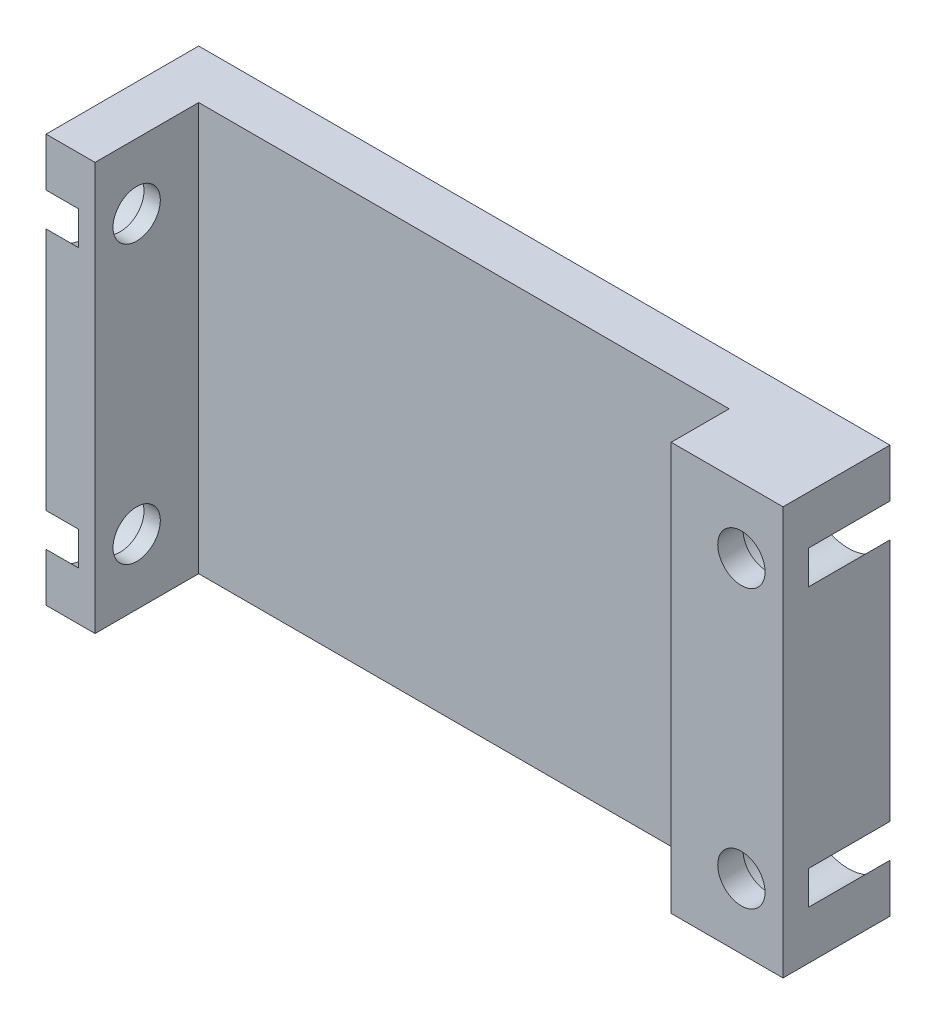
ISO-10303-21;
HEADER;
FILE_DESCRIPTION(('STEP AP214'),'2;1');
FILE_NAME('part.step','',(''),(''),'','','');
FILE_SCHEMA(('AUTOMOTIVE_DESIGN { 1 0 10303 214 1 1 1 1 }'));
ENDSEC;
DATA;
#1=APPLICATION_CONTEXT('core data for automotive mechanical design processes');
#2=APPLICATION_PROTOCOL_DEFINITION('international standard','automotive_design',2000,#1);
#3=PRODUCT_CONTEXT('',#1,'mechanical');
#4=PRODUCT('Part','Part','',(#3));
#5=PRODUCT_RELATED_PRODUCT_CATEGORY('part','',(#4));
#6=PRODUCT_DEFINITION_FORMATION('','',#4);
#7=PRODUCT_DEFINITION_CONTEXT('part definition',#1,'design');
#8=PRODUCT_DEFINITION('design','',#6,#7);
#9=PRODUCT_DEFINITION_SHAPE('','',#8);
#10=(LENGTH_UNIT() NAMED_UNIT(*) SI_UNIT(.MILLI.,.METRE.));
#11=(NAMED_UNIT(*) PLANE_ANGLE_UNIT() SI_UNIT($,.RADIAN.));
#12=(NAMED_UNIT(*) SI_UNIT($,.STERADIAN.) SOLID_ANGLE_UNIT());
#13=UNCERTAINTY_MEASURE_WITH_UNIT(LENGTH_MEASURE(1.E-05),#10,'distance_accuracy_value','');
#14=(GEOMETRIC_REPRESENTATION_CONTEXT(3) GLOBAL_UNCERTAINTY_ASSIGNED_CONTEXT((#13)) GLOBAL_UNIT_ASSIGNED_CONTEXT((#10,
#11,#12)) REPRESENTATION_CONTEXT('',''));
#15=CARTESIAN_POINT('',(0.,0.,0.));
#16=DIRECTION('',(0.,0.,1.));
#17=DIRECTION('',(1.,0.,0.));
#18=AXIS2_PLACEMENT_3D('',#15,#16,#17);
#19=CARTESIAN_POINT('',(-1.5,-22.5000000000001,-30.7214913134743));
#20=DIRECTION('',(-1.,0.,0.));
#21=DIRECTION('',(0.,0.,1.));
#22=AXIS2_PLACEMENT_3D('',#19,#20,#21);
#23=PLANE('',#22);
#24=DIRECTION('',(0.,1.,0.));
#25=VECTOR('',#24,1.);
#26=CARTESIAN_POINT('',(-1.5,-22.5000000000001,-3.79999999999977));
#27=LINE('',#26,#25);
#28=CARTESIAN_POINT('',(-1.5,-22.5000000000001,-3.79999999999977));
#29=VERTEX_POINT('',#28);
#30=CARTESIAN_POINT('',(-1.5,2.49999999999995,-3.79999999999978));
#31=VERTEX_POINT('',#30);
#32=EDGE_CURVE('E186',#29,#31,#27,.T.);
#33=ORIENTED_EDGE('',*,*,#32,.F.);
#34=DIRECTION('',(0.,0.,1.));
#35=VECTOR('',#34,1.);
#36=CARTESIAN_POINT('',(-1.5,-22.5000000000001,-30.7214913134743));
#37=LINE('',#36,#35);
#38=CARTESIAN_POINT('',(-1.5,-22.5000000000001,-0.25));
#39=VERTEX_POINT('',#38);
#40=EDGE_CURVE('E203',#29,#39,#37,.T.);
#41=ORIENTED_EDGE('',*,*,#40,.T.);
#42=DIRECTION('',(0.,-1.,0.));
#43=VECTOR('',#42,1.);
#44=CARTESIAN_POINT('',(-1.5,-22.5000000000001,-0.25));
#45=LINE('',#44,#43);
#46=CARTESIAN_POINT('',(-1.5,2.49999999999995,-0.25));
#47=VERTEX_POINT('',#46);
#48=EDGE_CURVE('E191',#47,#39,#45,.T.);
#49=ORIENTED_EDGE('',*,*,#48,.F.);
#50=DIRECTION('',(0.,0.,1.));
#51=VECTOR('',#50,1.);
#52=CARTESIAN_POINT('',(-1.5,2.49999999999995,-30.7214913134743));
#53=LINE('',#52,#51);
#54=EDGE_CURVE('E190',#31,#47,#53,.T.);
#55=ORIENTED_EDGE('',*,*,#54,.F.);
#56=EDGE_LOOP('',(#33,#41,#49,#55));
#57=FACE_BOUND('',#56,.T.);
#58=ADVANCED_FACE('F36',(#57),#23,.T.);
#59=CARTESIAN_POINT('',(-1.5,2.49999999999995,-30.7214913134743));
#60=DIRECTION('',(0.,1.,0.));
#61=DIRECTION('',(0.,0.,1.));
#62=AXIS2_PLACEMENT_3D('',#59,#60,#61);
#63=PLANE('',#62);
#64=DIRECTION('',(0.,0.,1.));
#65=VECTOR('',#64,1.);
#66=CARTESIAN_POINT('',(5.35008846034397,2.49999999999995,-30.7214913134743));
#67=LINE('',#66,#65);
#68=CARTESIAN_POINT('',(5.35008846034396,2.49999999999995,-6.79999999999978));
#69=VERTEX_POINT('',#68);
#70=CARTESIAN_POINT('',(5.35008846034397,2.49999999999995,-0.25));
#71=VERTEX_POINT('',#70);
#72=EDGE_CURVE('E205',#69,#71,#67,.T.);
#73=ORIENTED_EDGE('',*,*,#72,.F.);
#74=DIRECTION('',(1.,0.,0.));
#75=VECTOR('',#74,1.);
#76=CARTESIAN_POINT('',(5.35008846034396,2.49999999999995,-6.79999999999978));
#77=LINE('',#76,#75);
#78=CARTESIAN_POINT('',(-37.,2.49999999999995,-6.79999999999978));
#79=VERTEX_POINT('',#78);
#80=EDGE_CURVE('E166',#79,#69,#77,.T.);
#81=ORIENTED_EDGE('',*,*,#80,.F.);
#82=DIRECTION('',(0.,0.,-1.));
#83=VECTOR('',#82,1.);
#84=CARTESIAN_POINT('',(-37.,2.49999999999995,-6.79999999999978));
#85=LINE('',#84,#83);
#86=CARTESIAN_POINT('',(-37.,2.49999999999995,2.55));
#87=VERTEX_POINT('',#86);
#88=EDGE_CURVE('E278',#87,#79,#85,.T.);
#89=ORIENTED_EDGE('',*,*,#88,.F.);
#90=DIRECTION('',(1.,0.,0.));
#91=VECTOR('',#90,1.);
#92=CARTESIAN_POINT('',(-37.,2.49999999999995,2.55));
#93=LINE('',#92,#91);
#94=CARTESIAN_POINT('',(-34.,2.49999999999995,2.55));
#95=VERTEX_POINT('',#94);
#96=EDGE_CURVE('E282',#87,#95,#93,.T.);
#97=ORIENTED_EDGE('',*,*,#96,.T.);
#98=DIRECTION('',(0.,0.,-1.));
#99=VECTOR('',#98,1.);
#100=CARTESIAN_POINT('',(-34.,2.49999999999995,-6.79999999999978));
#101=LINE('',#100,#99);
#102=CARTESIAN_POINT('',(-34.,2.49999999999995,-3.79999999999978));
#103=VERTEX_POINT('',#102);
#104=EDGE_CURVE('E272',#95,#103,#101,.T.);
#105=ORIENTED_EDGE('',*,*,#104,.T.);
#106=DIRECTION('',(1.,0.,0.));
#107=VECTOR('',#106,1.);
#108=CARTESIAN_POINT('',(5.35008846034396,2.49999999999995,-3.79999999999978));
#109=LINE('',#108,#107);
#110=EDGE_CURVE('E173',#103,#31,#109,.T.);
#111=ORIENTED_EDGE('',*,*,#110,.T.);
#112=ORIENTED_EDGE('',*,*,#54,.T.);
#113=DIRECTION('',(-1.,0.,0.));
#114=VECTOR('',#113,1.);
#115=CARTESIAN_POINT('',(-1.5,2.49999999999995,-0.25));
#116=LINE('',#115,#114);
#117=EDGE_CURVE('E200',#71,#47,#116,.T.);
#118=ORIENTED_EDGE('',*,*,#117,.F.);
#119=EDGE_LOOP('',(#73,#81,#89,#97,#105,#111,#112,#118));
#120=FACE_BOUND('',#119,.T.);
#121=ADVANCED_FACE('F311',(#120),#63,.T.);
#122=CARTESIAN_POINT('',(5.35008846034397,-22.5000000000001,-30.7214913134743));
#123=DIRECTION('',(1.,0.,0.));
#124=DIRECTION('',(0.,0.,-1.));
#125=AXIS2_PLACEMENT_3D('',#122,#123,#124);
#126=PLANE('',#125);
#127=DIRECTION('',(0.,0.,-1.));
#128=VECTOR('',#127,1.);
#129=CARTESIAN_POINT('',(5.35008846034396,-2.52934389026236,-6.79999999999978));
#130=LINE('',#129,#128);
#131=CARTESIAN_POINT('',(5.35008846034397,-2.52934389026236,-1.79999999999977));
#132=VERTEX_POINT('',#131);
#133=CARTESIAN_POINT('',(5.35008846034396,-2.52934389026236,-6.79999999999978));
#134=VERTEX_POINT('',#133);
#135=EDGE_CURVE('E50',#132,#134,#130,.T.);
#136=ORIENTED_EDGE('',*,*,#135,.F.);
#137=DIRECTION('',(0.,-1.,0.));
#138=VECTOR('',#137,1.);
#139=CARTESIAN_POINT('',(5.35008846034397,-22.5000000000001,-1.79999999999977));
#140=LINE('',#139,#138);
#141=CARTESIAN_POINT('',(5.35008846034397,-0.470656109737746,-1.79999999999977));
#142=VERTEX_POINT('',#141);
#143=EDGE_CURVE('E11',#142,#132,#140,.T.);
#144=ORIENTED_EDGE('',*,*,#143,.F.);
#145=DIRECTION('',(0.,0.,-1.));
#146=VECTOR('',#145,1.);
#147=CARTESIAN_POINT('',(5.35008846034396,-0.470656109737747,-6.79999999999978));
#148=LINE('',#147,#146);
#149=CARTESIAN_POINT('',(5.35008846034396,-0.470656109737745,-6.79999999999978));
#150=VERTEX_POINT('',#149);
#151=EDGE_CURVE('E149',#150,#142,#148,.F.);
#152=ORIENTED_EDGE('',*,*,#151,.F.);
#153=DIRECTION('',(0.,-1.,0.));
#154=VECTOR('',#153,1.);
#155=CARTESIAN_POINT('',(5.35008846034396,2.49999999999995,-6.79999999999978));
#156=LINE('',#155,#154);
#157=EDGE_CURVE('E160',#69,#150,#156,.T.);
#158=ORIENTED_EDGE('',*,*,#157,.F.);
#159=ORIENTED_EDGE('',*,*,#72,.T.);
#160=DIRECTION('',(0.,1.,0.));
#161=VECTOR('',#160,1.);
#162=CARTESIAN_POINT('',(5.35008846034397,-22.5000000000001,-0.25));
#163=LINE('',#162,#161);
#164=CARTESIAN_POINT('',(5.35008846034397,-22.5000000000001,-0.25));
#165=VERTEX_POINT('',#164);
#166=EDGE_CURVE('E197',#165,#71,#163,.T.);
#167=ORIENTED_EDGE('',*,*,#166,.F.);
#168=DIRECTION('',(0.,0.,1.));
#169=VECTOR('',#168,1.);
#170=CARTESIAN_POINT('',(5.35008846034397,-22.5000000000001,-30.7214913134743));
#171=LINE('',#170,#169);
#172=CARTESIAN_POINT('',(5.35008846034396,-22.5000000000001,-6.79999999999978));
#173=VERTEX_POINT('',#172);
#174=EDGE_CURVE('E207',#173,#165,#171,.T.);
#175=ORIENTED_EDGE('',*,*,#174,.F.);
#176=CARTESIAN_POINT('',(5.35008846034396,-19.5293438902624,-6.79999999999978));
#177=VERTEX_POINT('',#176);
#178=EDGE_CURVE('E170',#177,#173,#156,.T.);
#179=ORIENTED_EDGE('',*,*,#178,.F.);
#180=DIRECTION('',(0.,0.,-1.));
#181=VECTOR('',#180,1.);
#182=CARTESIAN_POINT('',(5.35008846034396,-19.5293438902624,-6.79999999999978));
#183=LINE('',#182,#181);
#184=CARTESIAN_POINT('',(5.35008846034397,-19.5293438902624,-1.79999999999977));
#185=VERTEX_POINT('',#184);
#186=EDGE_CURVE('E58',#185,#177,#183,.T.);
#187=ORIENTED_EDGE('',*,*,#186,.F.);
#188=DIRECTION('',(0.,-1.,0.));
#189=VECTOR('',#188,1.);
#190=CARTESIAN_POINT('',(5.35008846034397,-22.5000000000001,-1.79999999999977));
#191=LINE('',#190,#189);
#192=CARTESIAN_POINT('',(5.35008846034397,-17.4706561097377,-1.79999999999977));
#193=VERTEX_POINT('',#192);
#194=EDGE_CURVE('E154',#193,#185,#191,.T.);
#195=ORIENTED_EDGE('',*,*,#194,.F.);
#196=DIRECTION('',(0.,0.,-1.));
#197=VECTOR('',#196,1.);
#198=CARTESIAN_POINT('',(5.35008846034396,-17.4706561097377,-6.79999999999978));
#199=LINE('',#198,#197);
#200=CARTESIAN_POINT('',(5.35008846034396,-17.4706561097377,-6.79999999999978));
#201=VERTEX_POINT('',#200);
#202=EDGE_CURVE('E236',#201,#193,#199,.F.);
#203=ORIENTED_EDGE('',*,*,#202,.F.);
#204=EDGE_CURVE('E168',#134,#201,#156,.T.);
#205=ORIENTED_EDGE('',*,*,#204,.F.);
#206=EDGE_LOOP('',(#136,#144,#152,#158,#159,#167,#175,#179,#187,#195,#203,#205));
#207=FACE_BOUND('',#206,.T.);
#208=ADVANCED_FACE('F159',(#207),#126,.T.);
#209=CARTESIAN_POINT('',(-1.5,-22.5000000000001,-30.7214913134743));
#210=DIRECTION('',(0.,-1.,0.));
#211=DIRECTION('',(0.,0.,-1.));
#212=AXIS2_PLACEMENT_3D('',#209,#210,#211);
#213=PLANE('',#212);
#214=ORIENTED_EDGE('',*,*,#40,.F.);
#215=DIRECTION('',(-1.,0.,0.));
#216=VECTOR('',#215,1.);
#217=CARTESIAN_POINT('',(5.35008846034396,-22.5000000000001,-3.79999999999978));
#218=LINE('',#217,#216);
#219=CARTESIAN_POINT('',(-34.,-22.5000000000001,-3.79999999999978));
#220=VERTEX_POINT('',#219);
#221=EDGE_CURVE('E182',#29,#220,#218,.T.);
#222=ORIENTED_EDGE('',*,*,#221,.T.);
#223=DIRECTION('',(0.,0.,1.));
#224=VECTOR('',#223,1.);
#225=CARTESIAN_POINT('',(-34.,-22.5000000000001,-6.79999999999978));
#226=LINE('',#225,#224);
#227=CARTESIAN_POINT('',(-34.,-22.5000000000001,2.55));
#228=VERTEX_POINT('',#227);
#229=EDGE_CURVE('E264',#220,#228,#226,.T.);
#230=ORIENTED_EDGE('',*,*,#229,.T.);
#231=DIRECTION('',(1.,0.,0.));
#232=VECTOR('',#231,1.);
#233=CARTESIAN_POINT('',(-37.,-22.5000000000001,2.55));
#234=LINE('',#233,#232);
#235=CARTESIAN_POINT('',(-37.,-22.5000000000001,2.55));
#236=VERTEX_POINT('',#235);
#237=EDGE_CURVE('E288',#236,#228,#234,.T.);
#238=ORIENTED_EDGE('',*,*,#237,.F.);
#239=DIRECTION('',(0.,0.,1.));
#240=VECTOR('',#239,1.);
#241=CARTESIAN_POINT('',(-37.,-22.5000000000001,-6.79999999999978));
#242=LINE('',#241,#240);
#243=CARTESIAN_POINT('',(-37.,-22.5000000000001,-6.79999999999978));
#244=VERTEX_POINT('',#243);
#245=EDGE_CURVE('E271',#244,#236,#242,.T.);
#246=ORIENTED_EDGE('',*,*,#245,.F.);
#247=DIRECTION('',(-1.,0.,0.));
#248=VECTOR('',#247,1.);
#249=CARTESIAN_POINT('',(5.35008846034396,-22.5000000000001,-6.79999999999978));
#250=LINE('',#249,#248);
#251=EDGE_CURVE('E167',#173,#244,#250,.T.);
#252=ORIENTED_EDGE('',*,*,#251,.F.);
#253=ORIENTED_EDGE('',*,*,#174,.T.);
#254=DIRECTION('',(1.,0.,0.));
#255=VECTOR('',#254,1.);
#256=CARTESIAN_POINT('',(-1.5,-22.5000000000001,-0.25));
#257=LINE('',#256,#255);
#258=EDGE_CURVE('E194',#39,#165,#257,.T.);
#259=ORIENTED_EDGE('',*,*,#258,.F.);
#260=EDGE_LOOP('',(#214,#222,#230,#238,#246,#252,#253,#259));
#261=FACE_BOUND('',#260,.T.);
#262=ADVANCED_FACE('F299',(#261),#213,.T.);
#263=CARTESIAN_POINT('',(0.,0.,-0.25));
#264=DIRECTION('',(0.,0.,-1.));
#265=DIRECTION('',(-1.,0.,0.));
#266=AXIS2_PLACEMENT_3D('',#263,#264,#265);
#267=PLANE('',#266);
#268=CARTESIAN_POINT('',(2.79999999999996,-1.50000000000005,-0.25));
#269=DIRECTION('',(0.,0.,-1.));
#270=DIRECTION('',(-1.,0.,0.));
#271=AXIS2_PLACEMENT_3D('',#268,#269,#270);
#272=CIRCLE('',#271,1.45);
#273=CARTESIAN_POINT('',(1.34999999999996,-1.50000000000005,-0.25));
#274=VERTEX_POINT('',#273);
#275=EDGE_CURVE('E161',#274,#274,#272,.T.);
#276=ORIENTED_EDGE('',*,*,#275,.T.);
#277=EDGE_LOOP('',(#276));
#278=FACE_BOUND('',#277,.T.);
#279=CARTESIAN_POINT('',(2.79999999999996,-18.5000000000001,-0.25));
#280=DIRECTION('',(0.,0.,-1.));
#281=DIRECTION('',(-1.,0.,0.));
#282=AXIS2_PLACEMENT_3D('',#279,#280,#281);
#283=CIRCLE('',#282,1.45);
#284=CARTESIAN_POINT('',(1.34999999999996,-18.5000000000001,-0.25));
#285=VERTEX_POINT('',#284);
#286=EDGE_CURVE('E233',#285,#285,#283,.T.);
#287=ORIENTED_EDGE('',*,*,#286,.T.);
#288=EDGE_LOOP('',(#287));
#289=FACE_BOUND('',#288,.T.);
#290=ORIENTED_EDGE('',*,*,#48,.T.);
#291=ORIENTED_EDGE('',*,*,#258,.T.);
#292=ORIENTED_EDGE('',*,*,#166,.T.);
#293=ORIENTED_EDGE('',*,*,#117,.T.);
#294=EDGE_LOOP('',(#290,#291,#292,#293));
#295=FACE_BOUND('',#294,.T.);
#296=ADVANCED_FACE('F353',(#278,#289,#295),#267,.F.);
#297=CARTESIAN_POINT('',(0.,0.,-3.79999999999978));
#298=DIRECTION('',(0.,0.,-1.));
#299=DIRECTION('',(-1.,0.,0.));
#300=AXIS2_PLACEMENT_3D('',#297,#298,#299);
#301=PLANE('',#300);
#302=ORIENTED_EDGE('',*,*,#221,.F.);
#303=ORIENTED_EDGE('',*,*,#32,.T.);
#304=ORIENTED_EDGE('',*,*,#110,.F.);
#305=DIRECTION('',(0.,1.,0.));
#306=VECTOR('',#305,1.);
#307=CARTESIAN_POINT('',(-34.,2.49999999999995,-3.79999999999978));
#308=LINE('',#307,#306);
#309=EDGE_CURVE('E177',#220,#103,#308,.T.);
#310=ORIENTED_EDGE('',*,*,#309,.F.);
#311=EDGE_LOOP('',(#302,#303,#304,#310));
#312=FACE_BOUND('',#311,.T.);
#313=ADVANCED_FACE('F303',(#312),#301,.F.);
#314=CARTESIAN_POINT('',(0.,0.,-6.79999999999978));
#315=DIRECTION('',(0.,0.,-1.));
#316=DIRECTION('',(-1.,0.,0.));
#317=AXIS2_PLACEMENT_3D('',#314,#315,#316);
#318=PLANE('',#317);
#319=CARTESIAN_POINT('',(2.79999999999996,-1.50000000000005,-6.79999999999978));
#320=DIRECTION('',(0.,0.,-1.));
#321=DIRECTION('',(-1.,0.,0.));
#322=AXIS2_PLACEMENT_3D('',#319,#320,#321);
#323=CIRCLE('',#322,2.75);
#324=EDGE_CURVE('E43',#134,#150,#323,.T.);
#325=ORIENTED_EDGE('',*,*,#324,.F.);
#326=ORIENTED_EDGE('',*,*,#204,.T.);
#327=CARTESIAN_POINT('',(2.79999999999996,-18.5000000000001,-6.79999999999978));
#328=DIRECTION('',(0.,0.,-1.));
#329=DIRECTION('',(-1.,0.,0.));
#330=AXIS2_PLACEMENT_3D('',#327,#328,#329);
#331=CIRCLE('',#330,2.75);
#332=EDGE_CURVE('E220',#177,#201,#331,.T.);
#333=ORIENTED_EDGE('',*,*,#332,.F.);
#334=ORIENTED_EDGE('',*,*,#178,.T.);
#335=ORIENTED_EDGE('',*,*,#251,.T.);
#336=DIRECTION('',(0.,-1.,0.));
#337=VECTOR('',#336,1.);
#338=CARTESIAN_POINT('',(-37.,-22.5000000000001,-6.79999999999978));
#339=LINE('',#338,#337);
#340=EDGE_CURVE('E268',#79,#244,#339,.T.);
#341=ORIENTED_EDGE('',*,*,#340,.F.);
#342=ORIENTED_EDGE('',*,*,#80,.T.);
#343=ORIENTED_EDGE('',*,*,#157,.T.);
#344=EDGE_LOOP('',(#325,#326,#333,#334,#335,#341,#342,#343));
#345=FACE_BOUND('',#344,.T.);
#346=ADVANCED_FACE('F164',(#345),#318,.T.);
#347=CARTESIAN_POINT('',(-37.,-22.5000000000001,2.55));
#348=DIRECTION('',(0.,0.,-1.));
#349=DIRECTION('',(-1.,0.,0.));
#350=AXIS2_PLACEMENT_3D('',#347,#348,#349);
#351=PLANE('',#350);
#352=DIRECTION('',(0.,-1.,0.));
#353=VECTOR('',#352,1.);
#354=CARTESIAN_POINT('',(-35.,-22.5000000000001,2.55));
#355=LINE('',#354,#353);
#356=CARTESIAN_POINT('',(-35.,-0.470436985901365,2.55));
#357=VERTEX_POINT('',#356);
#358=CARTESIAN_POINT('',(-35.,-2.52956301409878,2.55));
#359=VERTEX_POINT('',#358);
#360=EDGE_CURVE('E218',#357,#359,#355,.T.);
#361=ORIENTED_EDGE('',*,*,#360,.T.);
#362=DIRECTION('',(-1.,0.,0.));
#363=VECTOR('',#362,1.);
#364=CARTESIAN_POINT('',(-37.0000000000001,-2.52956301409878,2.55));
#365=LINE('',#364,#363);
#366=CARTESIAN_POINT('',(-37.0000000000001,-2.52956301409878,2.55));
#367=VERTEX_POINT('',#366);
#368=EDGE_CURVE('E253',#359,#367,#365,.T.);
#369=ORIENTED_EDGE('',*,*,#368,.T.);
#370=DIRECTION('',(0.,1.,0.));
#371=VECTOR('',#370,1.);
#372=CARTESIAN_POINT('',(-37.,-22.5000000000001,2.55));
#373=LINE('',#372,#371);
#374=CARTESIAN_POINT('',(-37.,-17.4704369859014,2.55));
#375=VERTEX_POINT('',#374);
#376=EDGE_CURVE('E279',#375,#367,#373,.T.);
#377=ORIENTED_EDGE('',*,*,#376,.F.);
#378=DIRECTION('',(-1.,0.,0.));
#379=VECTOR('',#378,1.);
#380=CARTESIAN_POINT('',(-37.,-17.4704369859014,2.55));
#381=LINE('',#380,#379);
#382=CARTESIAN_POINT('',(-35.,-17.4704369859014,2.55));
#383=VERTEX_POINT('',#382);
#384=EDGE_CURVE('E189',#375,#383,#381,.F.);
#385=ORIENTED_EDGE('',*,*,#384,.T.);
#386=DIRECTION('',(0.,-1.,0.));
#387=VECTOR('',#386,1.);
#388=CARTESIAN_POINT('',(-35.,-22.5000000000001,2.55));
#389=LINE('',#388,#387);
#390=CARTESIAN_POINT('',(-35.,-19.5295630140988,2.55));
#391=VERTEX_POINT('',#390);
#392=EDGE_CURVE('E212',#383,#391,#389,.T.);
#393=ORIENTED_EDGE('',*,*,#392,.T.);
#394=DIRECTION('',(-1.,0.,0.));
#395=VECTOR('',#394,1.);
#396=CARTESIAN_POINT('',(-37.,-19.5295630140988,2.55));
#397=LINE('',#396,#395);
#398=CARTESIAN_POINT('',(-37.,-19.5295630140988,2.55));
#399=VERTEX_POINT('',#398);
#400=EDGE_CURVE('E215',#391,#399,#397,.T.);
#401=ORIENTED_EDGE('',*,*,#400,.T.);
#402=EDGE_CURVE('E275',#236,#399,#373,.T.);
#403=ORIENTED_EDGE('',*,*,#402,.F.);
#404=ORIENTED_EDGE('',*,*,#237,.T.);
#405=DIRECTION('',(0.,1.,0.));
#406=VECTOR('',#405,1.);
#407=CARTESIAN_POINT('',(-34.,-22.5000000000001,2.55));
#408=LINE('',#407,#406);
#409=EDGE_CURVE('E284',#228,#95,#408,.T.);
#410=ORIENTED_EDGE('',*,*,#409,.T.);
#411=ORIENTED_EDGE('',*,*,#96,.F.);
#412=CARTESIAN_POINT('',(-37.,-0.470436985901365,2.55));
#413=VERTEX_POINT('',#412);
#414=EDGE_CURVE('E274',#413,#87,#373,.T.);
#415=ORIENTED_EDGE('',*,*,#414,.F.);
#416=DIRECTION('',(-1.,0.,0.));
#417=VECTOR('',#416,1.);
#418=CARTESIAN_POINT('',(-37.0000000000001,-0.470436985901365,2.55));
#419=LINE('',#418,#417);
#420=EDGE_CURVE('E247',#413,#357,#419,.F.);
#421=ORIENTED_EDGE('',*,*,#420,.T.);
#422=EDGE_LOOP('',(#361,#369,#377,#385,#393,#401,#403,#404,#410,#411,#415,#421));
#423=FACE_BOUND('',#422,.T.);
#424=ADVANCED_FACE('F308',(#423),#351,.F.);
#425=CARTESIAN_POINT('',(-37.,0.,0.));
#426=DIRECTION('',(1.,0.,0.));
#427=DIRECTION('',(0.,0.,-1.));
#428=AXIS2_PLACEMENT_3D('',#425,#426,#427);
#429=PLANE('',#428);
#430=ORIENTED_EDGE('',*,*,#376,.T.);
#431=CARTESIAN_POINT('',(-37.0000000000001,-1.50000000000007,0.));
#432=DIRECTION('',(-1.,0.,0.));
#433=DIRECTION('',(0.,0.,1.));
#434=AXIS2_PLACEMENT_3D('',#431,#432,#433);
#435=CIRCLE('',#434,2.75);
#436=EDGE_CURVE('E239',#413,#367,#435,.T.);
#437=ORIENTED_EDGE('',*,*,#436,.F.);
#438=ORIENTED_EDGE('',*,*,#414,.T.);
#439=ORIENTED_EDGE('',*,*,#88,.T.);
#440=ORIENTED_EDGE('',*,*,#340,.T.);
#441=ORIENTED_EDGE('',*,*,#245,.T.);
#442=ORIENTED_EDGE('',*,*,#402,.T.);
#443=CARTESIAN_POINT('',(-37.,-18.5000000000001,0.));
#444=DIRECTION('',(-1.,0.,0.));
#445=DIRECTION('',(0.,0.,1.));
#446=AXIS2_PLACEMENT_3D('',#443,#444,#445);
#447=CIRCLE('',#446,2.75);
#448=EDGE_CURVE('E256',#375,#399,#447,.T.);
#449=ORIENTED_EDGE('',*,*,#448,.F.);
#450=EDGE_LOOP('',(#430,#437,#438,#439,#440,#441,#442,#449));
#451=FACE_BOUND('',#450,.T.);
#452=ADVANCED_FACE('F314',(#451),#429,.F.);
#453=CARTESIAN_POINT('',(-34.,0.,0.));
#454=DIRECTION('',(1.,0.,0.));
#455=DIRECTION('',(0.,0.,-1.));
#456=AXIS2_PLACEMENT_3D('',#453,#454,#455);
#457=PLANE('',#456);
#458=CARTESIAN_POINT('',(-34.,-1.50000000000007,0.));
#459=DIRECTION('',(1.,0.,0.));
#460=DIRECTION('',(0.,0.,-1.));
#461=AXIS2_PLACEMENT_3D('',#458,#459,#460);
#462=CIRCLE('',#461,1.45);
#463=CARTESIAN_POINT('',(-34.,-1.50000000000007,-1.45));
#464=VERTEX_POINT('',#463);
#465=EDGE_CURVE('E244',#464,#464,#462,.F.);
#466=ORIENTED_EDGE('',*,*,#465,.T.);
#467=EDGE_LOOP('',(#466));
#468=FACE_BOUND('',#467,.T.);
#469=CARTESIAN_POINT('',(-34.,-18.5000000000001,0.));
#470=DIRECTION('',(1.,0.,0.));
#471=DIRECTION('',(0.,0.,-1.));
#472=AXIS2_PLACEMENT_3D('',#469,#470,#471);
#473=CIRCLE('',#472,1.45);
#474=CARTESIAN_POINT('',(-34.,-18.5000000000001,-1.45));
#475=VERTEX_POINT('',#474);
#476=EDGE_CURVE('E261',#475,#475,#473,.F.);
#477=ORIENTED_EDGE('',*,*,#476,.T.);
#478=EDGE_LOOP('',(#477));
#479=FACE_BOUND('',#478,.T.);
#480=ORIENTED_EDGE('',*,*,#229,.F.);
#481=ORIENTED_EDGE('',*,*,#309,.T.);
#482=ORIENTED_EDGE('',*,*,#104,.F.);
#483=ORIENTED_EDGE('',*,*,#409,.F.);
#484=EDGE_LOOP('',(#480,#481,#482,#483));
#485=FACE_BOUND('',#484,.T.);
#486=ADVANCED_FACE('F306',(#468,#479,#485),#457,.T.);
#487=CARTESIAN_POINT('',(-35.,-17.0500000000001,0.));
#488=DIRECTION('',(1.,0.,0.));
#489=DIRECTION('',(0.,0.,-1.));
#490=AXIS2_PLACEMENT_3D('',#487,#488,#489);
#491=PLANE('',#490);
#492=CARTESIAN_POINT('',(-35.,-18.5000000000001,0.));
#493=DIRECTION('',(-1.,0.,0.));
#494=DIRECTION('',(0.,0.,1.));
#495=AXIS2_PLACEMENT_3D('',#492,#493,#494);
#496=CIRCLE('',#495,1.45);
#497=CARTESIAN_POINT('',(-35.,-18.5000000000001,1.45));
#498=VERTEX_POINT('',#497);
#499=EDGE_CURVE('E257',#498,#498,#496,.T.);
#500=ORIENTED_EDGE('',*,*,#499,.F.);
#501=EDGE_LOOP('',(#500));
#502=FACE_BOUND('',#501,.T.);
#503=CARTESIAN_POINT('',(-35.,-18.5000000000001,0.));
#504=DIRECTION('',(-1.,0.,0.));
#505=DIRECTION('',(0.,0.,1.));
#506=AXIS2_PLACEMENT_3D('',#503,#504,#505);
#507=CIRCLE('',#506,2.75);
#508=EDGE_CURVE('E260',#383,#391,#507,.T.);
#509=ORIENTED_EDGE('',*,*,#508,.T.);
#510=ORIENTED_EDGE('',*,*,#392,.F.);
#511=EDGE_LOOP('',(#509,#510));
#512=FACE_BOUND('',#511,.T.);
#513=ADVANCED_FACE('F324',(#502,#512),#491,.F.);
#514=CARTESIAN_POINT('',(-37.,-18.5000000000001,0.));
#515=DIRECTION('',(-1.,0.,0.));
#516=DIRECTION('',(0.,0.,1.));
#517=AXIS2_PLACEMENT_3D('',#514,#515,#516);
#518=CYLINDRICAL_SURFACE('',#517,2.75);
#519=ORIENTED_EDGE('',*,*,#508,.F.);
#520=ORIENTED_EDGE('',*,*,#384,.F.);
#521=ORIENTED_EDGE('',*,*,#448,.T.);
#522=ORIENTED_EDGE('',*,*,#400,.F.);
#523=EDGE_LOOP('',(#519,#520,#521,#522));
#524=FACE_BOUND('',#523,.T.);
#525=ADVANCED_FACE('F322',(#524),#518,.F.);
#526=CARTESIAN_POINT('',(-37.,-18.5000000000001,0.));
#527=DIRECTION('',(-1.,0.,0.));
#528=DIRECTION('',(0.,0.,1.));
#529=AXIS2_PLACEMENT_3D('',#526,#527,#528);
#530=CYLINDRICAL_SURFACE('',#529,1.45);
#531=ORIENTED_EDGE('',*,*,#476,.F.);
#532=EDGE_LOOP('',(#531));
#533=FACE_BOUND('',#532,.T.);
#534=ORIENTED_EDGE('',*,*,#499,.T.);
#535=EDGE_LOOP('',(#534));
#536=FACE_BOUND('',#535,.T.);
#537=ADVANCED_FACE('F331',(#533,#536),#530,.F.);
#538=CARTESIAN_POINT('',(-35.,-0.0500000000000715,0.));
#539=DIRECTION('',(1.,0.,0.));
#540=DIRECTION('',(0.,0.,-1.));
#541=AXIS2_PLACEMENT_3D('',#538,#539,#540);
#542=PLANE('',#541);
#543=CARTESIAN_POINT('',(-35.,-1.50000000000007,0.));
#544=DIRECTION('',(-1.,0.,0.));
#545=DIRECTION('',(0.,0.,1.));
#546=AXIS2_PLACEMENT_3D('',#543,#544,#545);
#547=CIRCLE('',#546,1.45);
#548=CARTESIAN_POINT('',(-35.,-1.50000000000007,1.45));
#549=VERTEX_POINT('',#548);
#550=EDGE_CURVE('E240',#549,#549,#547,.T.);
#551=ORIENTED_EDGE('',*,*,#550,.F.);
#552=EDGE_LOOP('',(#551));
#553=FACE_BOUND('',#552,.T.);
#554=CARTESIAN_POINT('',(-35.,-1.50000000000007,0.));
#555=DIRECTION('',(-1.,0.,0.));
#556=DIRECTION('',(0.,0.,1.));
#557=AXIS2_PLACEMENT_3D('',#554,#555,#556);
#558=CIRCLE('',#557,2.75);
#559=EDGE_CURVE('E243',#357,#359,#558,.T.);
#560=ORIENTED_EDGE('',*,*,#559,.T.);
#561=ORIENTED_EDGE('',*,*,#360,.F.);
#562=EDGE_LOOP('',(#560,#561));
#563=FACE_BOUND('',#562,.T.);
#564=ADVANCED_FACE('F329',(#553,#563),#542,.F.);
#565=CARTESIAN_POINT('',(-37.0000000000001,-1.50000000000007,0.));
#566=DIRECTION('',(-1.,0.,0.));
#567=DIRECTION('',(0.,0.,1.));
#568=AXIS2_PLACEMENT_3D('',#565,#566,#567);
#569=CYLINDRICAL_SURFACE('',#568,2.75);
#570=ORIENTED_EDGE('',*,*,#559,.F.);
#571=ORIENTED_EDGE('',*,*,#420,.F.);
#572=ORIENTED_EDGE('',*,*,#436,.T.);
#573=ORIENTED_EDGE('',*,*,#368,.F.);
#574=EDGE_LOOP('',(#570,#571,#572,#573));
#575=FACE_BOUND('',#574,.T.);
#576=ADVANCED_FACE('F327',(#575),#569,.F.);
#577=CARTESIAN_POINT('',(-37.0000000000001,-1.50000000000007,0.));
#578=DIRECTION('',(-1.,0.,0.));
#579=DIRECTION('',(0.,0.,1.));
#580=AXIS2_PLACEMENT_3D('',#577,#578,#579);
#581=CYLINDRICAL_SURFACE('',#580,1.45);
#582=ORIENTED_EDGE('',*,*,#465,.F.);
#583=EDGE_LOOP('',(#582));
#584=FACE_BOUND('',#583,.T.);
#585=ORIENTED_EDGE('',*,*,#550,.T.);
#586=EDGE_LOOP('',(#585));
#587=FACE_BOUND('',#586,.T.);
#588=ADVANCED_FACE('F338',(#584,#587),#581,.F.);
#589=CARTESIAN_POINT('',(2.79999999999996,-18.5000000000001,-6.79999999999978));
#590=DIRECTION('',(0.,0.,-1.));
#591=DIRECTION('',(-1.,0.,0.));
#592=AXIS2_PLACEMENT_3D('',#589,#590,#591);
#593=CYLINDRICAL_SURFACE('',#592,1.45);
#594=ORIENTED_EDGE('',*,*,#286,.F.);
#595=EDGE_LOOP('',(#594));
#596=FACE_BOUND('',#595,.T.);
#597=CARTESIAN_POINT('',(2.79999999999996,-18.5000000000001,-1.79999999999977));
#598=DIRECTION('',(0.,0.,-1.));
#599=DIRECTION('',(-1.,0.,0.));
#600=AXIS2_PLACEMENT_3D('',#597,#598,#599);
#601=CIRCLE('',#600,1.45);
#602=CARTESIAN_POINT('',(1.34999999999996,-18.5000000000001,-1.79999999999977));
#603=VERTEX_POINT('',#602);
#604=EDGE_CURVE('E230',#603,#603,#601,.T.);
#605=ORIENTED_EDGE('',*,*,#604,.T.);
#606=EDGE_LOOP('',(#605));
#607=FACE_BOUND('',#606,.T.);
#608=ADVANCED_FACE('F359',(#596,#607),#593,.F.);
#609=CARTESIAN_POINT('',(4.24999999999996,-18.5000000000001,-1.79999999999977));
#610=DIRECTION('',(0.,0.,1.));
#611=DIRECTION('',(1.,0.,0.));
#612=AXIS2_PLACEMENT_3D('',#609,#610,#611);
#613=PLANE('',#612);
#614=ORIENTED_EDGE('',*,*,#194,.T.);
#615=CARTESIAN_POINT('',(2.79999999999996,-18.5000000000001,-1.79999999999977));
#616=DIRECTION('',(0.,0.,-1.));
#617=DIRECTION('',(-1.,0.,0.));
#618=AXIS2_PLACEMENT_3D('',#615,#616,#617);
#619=CIRCLE('',#618,2.75);
#620=EDGE_CURVE('E228',#185,#193,#619,.T.);
#621=ORIENTED_EDGE('',*,*,#620,.T.);
#622=EDGE_LOOP('',(#614,#621));
#623=FACE_BOUND('',#622,.T.);
#624=ORIENTED_EDGE('',*,*,#604,.F.);
#625=EDGE_LOOP('',(#624));
#626=FACE_BOUND('',#625,.T.);
#627=ADVANCED_FACE('F356',(#623,#626),#613,.F.);
#628=CARTESIAN_POINT('',(2.79999999999996,-18.5000000000001,-6.79999999999978));
#629=DIRECTION('',(0.,0.,-1.));
#630=DIRECTION('',(-1.,0.,0.));
#631=AXIS2_PLACEMENT_3D('',#628,#629,#630);
#632=CYLINDRICAL_SURFACE('',#631,2.75);
#633=ORIENTED_EDGE('',*,*,#186,.T.);
#634=ORIENTED_EDGE('',*,*,#332,.T.);
#635=ORIENTED_EDGE('',*,*,#202,.T.);
#636=ORIENTED_EDGE('',*,*,#620,.F.);
#637=EDGE_LOOP('',(#633,#634,#635,#636));
#638=FACE_BOUND('',#637,.T.);
#639=ADVANCED_FACE('F355',(#638),#632,.F.);
#640=CARTESIAN_POINT('',(2.79999999999996,-1.50000000000005,-6.79999999999978));
#641=DIRECTION('',(0.,0.,-1.));
#642=DIRECTION('',(-1.,0.,0.));
#643=AXIS2_PLACEMENT_3D('',#640,#641,#642);
#644=CYLINDRICAL_SURFACE('',#643,1.45);
#645=ORIENTED_EDGE('',*,*,#275,.F.);
#646=EDGE_LOOP('',(#645));
#647=FACE_BOUND('',#646,.T.);
#648=CARTESIAN_POINT('',(2.79999999999996,-1.50000000000005,-1.79999999999977));
#649=DIRECTION('',(0.,0.,-1.));
#650=DIRECTION('',(-1.,0.,0.));
#651=AXIS2_PLACEMENT_3D('',#648,#649,#650);
#652=CIRCLE('',#651,1.45);
#653=CARTESIAN_POINT('',(1.34999999999996,-1.50000000000005,-1.79999999999977));
#654=VERTEX_POINT('',#653);
#655=EDGE_CURVE('E550',#654,#654,#652,.T.);
#656=ORIENTED_EDGE('',*,*,#655,.T.);
#657=EDGE_LOOP('',(#656));
#658=FACE_BOUND('',#657,.T.);
#659=ADVANCED_FACE('F374',(#647,#658),#644,.F.);
#660=CARTESIAN_POINT('',(4.24999999999996,-1.50000000000005,-1.79999999999977));
#661=DIRECTION('',(0.,0.,1.));
#662=DIRECTION('',(1.,0.,0.));
#663=AXIS2_PLACEMENT_3D('',#660,#661,#662);
#664=PLANE('',#663);
#665=ORIENTED_EDGE('',*,*,#143,.T.);
#666=CARTESIAN_POINT('',(2.79999999999996,-1.50000000000005,-1.79999999999977));
#667=DIRECTION('',(0.,0.,-1.));
#668=DIRECTION('',(-1.,0.,0.));
#669=AXIS2_PLACEMENT_3D('',#666,#667,#668);
#670=CIRCLE('',#669,2.75);
#671=EDGE_CURVE('E553',#132,#142,#670,.T.);
#672=ORIENTED_EDGE('',*,*,#671,.T.);
#673=EDGE_LOOP('',(#665,#672));
#674=FACE_BOUND('',#673,.T.);
#675=ORIENTED_EDGE('',*,*,#655,.F.);
#676=EDGE_LOOP('',(#675));
#677=FACE_BOUND('',#676,.T.);
#678=ADVANCED_FACE('F377',(#674,#677),#664,.F.);
#679=CARTESIAN_POINT('',(2.79999999999996,-1.50000000000005,-6.79999999999978));
#680=DIRECTION('',(0.,0.,-1.));
#681=DIRECTION('',(-1.,0.,0.));
#682=AXIS2_PLACEMENT_3D('',#679,#680,#681);
#683=CYLINDRICAL_SURFACE('',#682,2.75);
#684=ORIENTED_EDGE('',*,*,#135,.T.);
#685=ORIENTED_EDGE('',*,*,#324,.T.);
#686=ORIENTED_EDGE('',*,*,#151,.T.);
#687=ORIENTED_EDGE('',*,*,#671,.F.);
#688=EDGE_LOOP('',(#684,#685,#686,#687));
#689=FACE_BOUND('',#688,.T.);
#690=ADVANCED_FACE('F148',(#689),#683,.F.);
#691=CLOSED_SHELL('',(#58,#121,#208,#262,#296,#313,#346,#424,#452,#486,#513,#525,#537,#564,#576,
#588,#608,#627,#639,#659,#678,#690));
#692=MANIFOLD_SOLID_BREP('B2',#691);
#693=ADVANCED_BREP_SHAPE_REPRESENTATION('',(#18,#692),#14);
#694=SHAPE_DEFINITION_REPRESENTATION(#9,#693);
ENDSEC;
END-ISO-10303-21;
